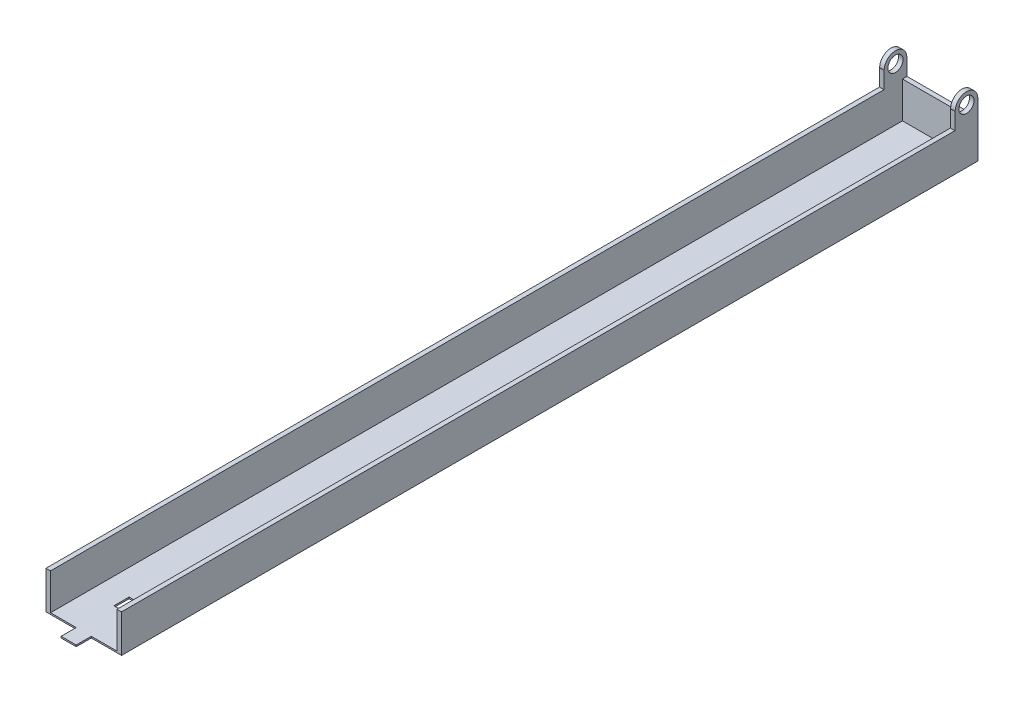
ISO-10303-21;
HEADER;
FILE_DESCRIPTION(('STEP AP214'),'2;1');
FILE_NAME('part.step','',(''),(''),'','','');
FILE_SCHEMA(('AUTOMOTIVE_DESIGN { 1 0 10303 214 1 1 1 1 }'));
ENDSEC;
DATA;
#1=APPLICATION_CONTEXT('core data for automotive mechanical design processes');
#2=APPLICATION_PROTOCOL_DEFINITION('international standard','automotive_design',2000,#1);
#3=PRODUCT_CONTEXT('',#1,'mechanical');
#4=PRODUCT('Part','Part','',(#3));
#5=PRODUCT_RELATED_PRODUCT_CATEGORY('part','',(#4));
#6=PRODUCT_DEFINITION_FORMATION('','',#4);
#7=PRODUCT_DEFINITION_CONTEXT('part definition',#1,'design');
#8=PRODUCT_DEFINITION('design','',#6,#7);
#9=PRODUCT_DEFINITION_SHAPE('','',#8);
#10=(LENGTH_UNIT() NAMED_UNIT(*) SI_UNIT(.MILLI.,.METRE.));
#11=(NAMED_UNIT(*) PLANE_ANGLE_UNIT() SI_UNIT($,.RADIAN.));
#12=(NAMED_UNIT(*) SI_UNIT($,.STERADIAN.) SOLID_ANGLE_UNIT());
#13=UNCERTAINTY_MEASURE_WITH_UNIT(LENGTH_MEASURE(1.E-05),#10,'distance_accuracy_value','');
#14=(GEOMETRIC_REPRESENTATION_CONTEXT(3) GLOBAL_UNCERTAINTY_ASSIGNED_CONTEXT((#13)) GLOBAL_UNIT_ASSIGNED_CONTEXT((#10,
#11,#12)) REPRESENTATION_CONTEXT('',''));
#15=CARTESIAN_POINT('',(0.,0.,0.));
#16=DIRECTION('',(0.,0.,1.));
#17=DIRECTION('',(1.,0.,0.));
#18=AXIS2_PLACEMENT_3D('',#15,#16,#17);
#19=CARTESIAN_POINT('',(0.,0.,-0.762));
#20=DIRECTION('',(0.,0.,-1.));
#21=DIRECTION('',(-1.,0.,0.));
#22=AXIS2_PLACEMENT_3D('',#19,#20,#21);
#23=PLANE('',#22);
#24=DIRECTION('',(0.,1.,0.));
#25=VECTOR('',#24,1.);
#26=CARTESIAN_POINT('',(1.27,-2.921,-0.762));
#27=LINE('',#26,#25);
#28=CARTESIAN_POINT('',(1.27,-3.175,-0.762));
#29=VERTEX_POINT('',#28);
#30=CARTESIAN_POINT('',(1.27,-2.921,-0.762));
#31=VERTEX_POINT('',#30);
#32=EDGE_CURVE('E248',#29,#31,#27,.T.);
#33=ORIENTED_EDGE('',*,*,#32,.F.);
#34=DIRECTION('',(1.,0.,0.));
#35=VECTOR('',#34,1.);
#36=CARTESIAN_POINT('',(-6.35,-3.175,-0.762));
#37=LINE('',#36,#35);
#38=CARTESIAN_POINT('',(6.35,-3.175,-0.762));
#39=VERTEX_POINT('',#38);
#40=EDGE_CURVE('E282',#29,#39,#37,.T.);
#41=ORIENTED_EDGE('',*,*,#40,.T.);
#42=DIRECTION('',(0.,1.,0.));
#43=VECTOR('',#42,1.);
#44=CARTESIAN_POINT('',(6.35,-3.175,-0.762));
#45=LINE('',#44,#43);
#46=CARTESIAN_POINT('',(6.35,3.175,-0.762));
#47=VERTEX_POINT('',#46);
#48=EDGE_CURVE('E275',#39,#47,#45,.T.);
#49=ORIENTED_EDGE('',*,*,#48,.T.);
#50=DIRECTION('',(-1.,0.,0.));
#51=VECTOR('',#50,1.);
#52=CARTESIAN_POINT('',(-6.35,3.175,-0.762));
#53=LINE('',#52,#51);
#54=CARTESIAN_POINT('',(5.588,3.175,-0.762));
#55=VERTEX_POINT('',#54);
#56=EDGE_CURVE('E278',#47,#55,#53,.T.);
#57=ORIENTED_EDGE('',*,*,#56,.T.);
#58=DIRECTION('',(0.,1.,0.));
#59=VECTOR('',#58,1.);
#60=CARTESIAN_POINT('',(5.588,-2.921,-0.762));
#61=LINE('',#60,#59);
#62=CARTESIAN_POINT('',(5.588,-2.921,-0.762));
#63=VERTEX_POINT('',#62);
#64=EDGE_CURVE('E285',#63,#55,#61,.T.);
#65=ORIENTED_EDGE('',*,*,#64,.F.);
#66=DIRECTION('',(-1.,0.,0.));
#67=VECTOR('',#66,1.);
#68=CARTESIAN_POINT('',(0.,-2.921,-0.762));
#69=LINE('',#68,#67);
#70=EDGE_CURVE('E11',#63,#31,#69,.T.);
#71=ORIENTED_EDGE('',*,*,#70,.T.);
#72=EDGE_LOOP('',(#33,#41,#49,#57,#65,#71));
#73=FACE_BOUND('',#72,.T.);
#74=ADVANCED_FACE('F41',(#73),#23,.F.);
#75=DIRECTION('',(0.,-1.,0.));
#76=VECTOR('',#75,1.);
#77=CARTESIAN_POINT('',(-1.27,-2.921,-0.762));
#78=LINE('',#77,#76);
#79=CARTESIAN_POINT('',(-1.27,-2.921,-0.762));
#80=VERTEX_POINT('',#79);
#81=CARTESIAN_POINT('',(-1.27,-3.175,-0.762));
#82=VERTEX_POINT('',#81);
#83=EDGE_CURVE('E253',#80,#82,#78,.T.);
#84=ORIENTED_EDGE('',*,*,#83,.F.);
#85=CARTESIAN_POINT('',(-5.588,-2.921,-0.762));
#86=VERTEX_POINT('',#85);
#87=EDGE_CURVE('E49',#80,#86,#69,.T.);
#88=ORIENTED_EDGE('',*,*,#87,.T.);
#89=DIRECTION('',(0.,-1.,0.));
#90=VECTOR('',#89,1.);
#91=CARTESIAN_POINT('',(-5.588,-2.921,-0.762000000000013));
#92=LINE('',#91,#90);
#93=CARTESIAN_POINT('',(-5.588,3.175,-0.762));
#94=VERTEX_POINT('',#93);
#95=EDGE_CURVE('E288',#94,#86,#92,.T.);
#96=ORIENTED_EDGE('',*,*,#95,.F.);
#97=CARTESIAN_POINT('',(-6.35,3.175,-0.762));
#98=VERTEX_POINT('',#97);
#99=EDGE_CURVE('E277',#94,#98,#53,.T.);
#100=ORIENTED_EDGE('',*,*,#99,.T.);
#101=DIRECTION('',(0.,-1.,0.));
#102=VECTOR('',#101,1.);
#103=CARTESIAN_POINT('',(-6.35,-3.175,-0.762));
#104=LINE('',#103,#102);
#105=CARTESIAN_POINT('',(-6.35,-3.175,-0.762));
#106=VERTEX_POINT('',#105);
#107=EDGE_CURVE('E280',#98,#106,#104,.T.);
#108=ORIENTED_EDGE('',*,*,#107,.T.);
#109=EDGE_CURVE('E283',#106,#82,#37,.T.);
#110=ORIENTED_EDGE('',*,*,#109,.T.);
#111=EDGE_LOOP('',(#84,#88,#96,#100,#108,#110));
#112=FACE_BOUND('',#111,.T.);
#113=ADVANCED_FACE('F461',(#112),#23,.F.);
#114=CARTESIAN_POINT('',(-6.35,3.175,-144.78));
#115=DIRECTION('',(0.,1.,0.));
#116=DIRECTION('',(0.,0.,1.));
#117=AXIS2_PLACEMENT_3D('',#114,#115,#116);
#118=PLANE('',#117);
#119=ORIENTED_EDGE('',*,*,#56,.F.);
#120=DIRECTION('',(0.,0.,1.));
#121=VECTOR('',#120,1.);
#122=CARTESIAN_POINT('',(6.35,3.175,-144.78));
#123=LINE('',#122,#121);
#124=CARTESIAN_POINT('',(6.35,3.175,-140.908247461621));
#125=VERTEX_POINT('',#124);
#126=EDGE_CURVE('E414',#125,#47,#123,.T.);
#127=ORIENTED_EDGE('',*,*,#126,.F.);
#128=DIRECTION('',(1.,0.,0.));
#129=VECTOR('',#128,1.);
#130=CARTESIAN_POINT('',(5.588,3.175,-140.908247461621));
#131=LINE('',#130,#129);
#132=CARTESIAN_POINT('',(5.588,3.175,-140.908247461621));
#133=VERTEX_POINT('',#132);
#134=EDGE_CURVE('E371',#133,#125,#131,.T.);
#135=ORIENTED_EDGE('',*,*,#134,.F.);
#136=DIRECTION('',(0.,0.,-1.));
#137=VECTOR('',#136,1.);
#138=CARTESIAN_POINT('',(5.588,3.175,-0.762));
#139=LINE('',#138,#137);
#140=EDGE_CURVE('E373',#55,#133,#139,.T.);
#141=ORIENTED_EDGE('',*,*,#140,.F.);
#142=EDGE_LOOP('',(#119,#127,#135,#141));
#143=FACE_BOUND('',#142,.T.);
#144=ADVANCED_FACE('F431',(#143),#118,.T.);
#145=DIRECTION('',(-1.,0.,0.));
#146=VECTOR('',#145,1.);
#147=CARTESIAN_POINT('',(-6.35,3.175,-144.78));
#148=LINE('',#147,#146);
#149=CARTESIAN_POINT('',(5.588,3.175,-144.78));
#150=VERTEX_POINT('',#149);
#151=CARTESIAN_POINT('',(-5.588,3.175,-144.78));
#152=VERTEX_POINT('',#151);
#153=EDGE_CURVE('E405',#150,#152,#148,.T.);
#154=ORIENTED_EDGE('',*,*,#153,.T.);
#155=DIRECTION('',(0.,0.,-1.));
#156=VECTOR('',#155,1.);
#157=CARTESIAN_POINT('',(-5.588,3.175,-140.908247461621));
#158=LINE('',#157,#156);
#159=CARTESIAN_POINT('',(-5.588,3.175,-144.018));
#160=VERTEX_POINT('',#159);
#161=EDGE_CURVE('E298',#160,#152,#158,.T.);
#162=ORIENTED_EDGE('',*,*,#161,.F.);
#163=DIRECTION('',(-1.,0.,0.));
#164=VECTOR('',#163,1.);
#165=CARTESIAN_POINT('',(5.588,3.175,-144.018));
#166=LINE('',#165,#164);
#167=CARTESIAN_POINT('',(5.588,3.175,-144.018));
#168=VERTEX_POINT('',#167);
#169=EDGE_CURVE('E393',#168,#160,#166,.T.);
#170=ORIENTED_EDGE('',*,*,#169,.F.);
#171=DIRECTION('',(0.,0.,-1.));
#172=VECTOR('',#171,1.);
#173=CARTESIAN_POINT('',(5.588,3.175,-140.908247461621));
#174=LINE('',#173,#172);
#175=EDGE_CURVE('E340',#168,#150,#174,.T.);
#176=ORIENTED_EDGE('',*,*,#175,.T.);
#177=EDGE_LOOP('',(#154,#162,#170,#176));
#178=FACE_BOUND('',#177,.T.);
#179=ADVANCED_FACE('F470',(#178),#118,.T.);
#180=ORIENTED_EDGE('',*,*,#99,.F.);
#181=DIRECTION('',(0.,0.,1.));
#182=VECTOR('',#181,1.);
#183=CARTESIAN_POINT('',(-5.588,3.175,-144.018));
#184=LINE('',#183,#182);
#185=CARTESIAN_POINT('',(-5.588,3.175,-140.908247461621));
#186=VERTEX_POINT('',#185);
#187=EDGE_CURVE('E386',#186,#94,#184,.T.);
#188=ORIENTED_EDGE('',*,*,#187,.F.);
#189=DIRECTION('',(-1.,0.,0.));
#190=VECTOR('',#189,1.);
#191=CARTESIAN_POINT('',(-5.588,3.175,-140.908247461621));
#192=LINE('',#191,#190);
#193=CARTESIAN_POINT('',(-6.35,3.175,-140.908247461621));
#194=VERTEX_POINT('',#193);
#195=EDGE_CURVE('E312',#186,#194,#192,.T.);
#196=ORIENTED_EDGE('',*,*,#195,.T.);
#197=DIRECTION('',(0.,0.,1.));
#198=VECTOR('',#197,1.);
#199=CARTESIAN_POINT('',(-6.35,3.175,-144.78));
#200=LINE('',#199,#198);
#201=EDGE_CURVE('E420',#194,#98,#200,.T.);
#202=ORIENTED_EDGE('',*,*,#201,.T.);
#203=EDGE_LOOP('',(#180,#188,#196,#202));
#204=FACE_BOUND('',#203,.T.);
#205=ADVANCED_FACE('F500',(#204),#118,.T.);
#206=CARTESIAN_POINT('',(6.35,3.175,-144.78));
#207=DIRECTION('',(1.,0.,0.));
#208=DIRECTION('',(0.,0.,-1.));
#209=AXIS2_PLACEMENT_3D('',#206,#207,#208);
#210=PLANE('',#209);
#211=ORIENTED_EDGE('',*,*,#48,.F.);
#212=DIRECTION('',(0.,0.,1.));
#213=VECTOR('',#212,1.);
#214=CARTESIAN_POINT('',(6.35,-3.175,-144.78));
#215=LINE('',#214,#213);
#216=CARTESIAN_POINT('',(6.35,-3.175,-144.78));
#217=VERTEX_POINT('',#216);
#218=EDGE_CURVE('E343',#217,#39,#215,.T.);
#219=ORIENTED_EDGE('',*,*,#218,.F.);
#220=DIRECTION('',(0.,1.,0.));
#221=VECTOR('',#220,1.);
#222=CARTESIAN_POINT('',(6.35,3.175,-144.78));
#223=LINE('',#222,#221);
#224=CARTESIAN_POINT('',(6.35,5.97952896515607,-144.78));
#225=VERTEX_POINT('',#224);
#226=EDGE_CURVE('E401',#217,#225,#223,.T.);
#227=ORIENTED_EDGE('',*,*,#226,.T.);
#228=DIRECTION('',(0.,0.,1.));
#229=VECTOR('',#228,1.);
#230=CARTESIAN_POINT('',(6.35,5.97952896515607,-144.78));
#231=LINE('',#230,#229);
#232=CARTESIAN_POINT('',(6.35,5.97952896515607,-144.749123730811));
#233=VERTEX_POINT('',#232);
#234=EDGE_CURVE('E337',#225,#233,#231,.T.);
#235=ORIENTED_EDGE('',*,*,#234,.T.);
#236=CARTESIAN_POINT('',(6.35,5.97952896515607,-142.844123730811));
#237=DIRECTION('',(1.,0.,0.));
#238=DIRECTION('',(0.,0.,-1.));
#239=AXIS2_PLACEMENT_3D('',#236,#237,#238);
#240=CIRCLE('',#239,1.90499999999999);
#241=CARTESIAN_POINT('',(6.35,5.97952896515607,-140.939123730811));
#242=VERTEX_POINT('',#241);
#243=EDGE_CURVE('E363',#233,#242,#240,.T.);
#244=ORIENTED_EDGE('',*,*,#243,.T.);
#245=DIRECTION('',(0.,0.,1.));
#246=VECTOR('',#245,1.);
#247=CARTESIAN_POINT('',(6.35,5.97952896515607,-140.939123730811));
#248=LINE('',#247,#246);
#249=CARTESIAN_POINT('',(6.35,5.97952896515607,-140.908247461621));
#250=VERTEX_POINT('',#249);
#251=EDGE_CURVE('E366',#242,#250,#248,.T.);
#252=ORIENTED_EDGE('',*,*,#251,.T.);
#253=DIRECTION('',(0.,-1.,0.));
#254=VECTOR('',#253,1.);
#255=CARTESIAN_POINT('',(6.35,5.97952896515607,-140.908247461621));
#256=LINE('',#255,#254);
#257=EDGE_CURVE('E348',#250,#125,#256,.T.);
#258=ORIENTED_EDGE('',*,*,#257,.T.);
#259=ORIENTED_EDGE('',*,*,#126,.T.);
#260=EDGE_LOOP('',(#211,#219,#227,#235,#244,#252,#258,#259));
#261=FACE_BOUND('',#260,.T.);
#262=CARTESIAN_POINT('',(6.35,5.97952896515607,-142.844123730811));
#263=DIRECTION('',(1.,0.,0.));
#264=DIRECTION('',(0.,0.,-1.));
#265=AXIS2_PLACEMENT_3D('',#262,#263,#264);
#266=CIRCLE('',#265,1.27);
#267=CARTESIAN_POINT('',(6.35,5.97952896515607,-144.114123730811));
#268=VERTEX_POINT('',#267);
#269=EDGE_CURVE('E322',#268,#268,#266,.T.);
#270=ORIENTED_EDGE('',*,*,#269,.F.);
#271=EDGE_LOOP('',(#270));
#272=FACE_BOUND('',#271,.T.);
#273=ADVANCED_FACE('F43',(#261,#272),#210,.T.);
#274=CARTESIAN_POINT('',(-6.35,-3.175,-144.78));
#275=DIRECTION('',(0.,-1.,0.));
#276=DIRECTION('',(0.,0.,-1.));
#277=AXIS2_PLACEMENT_3D('',#274,#275,#276);
#278=PLANE('',#277);
#279=DIRECTION('',(0.,0.,1.));
#280=VECTOR('',#279,1.);
#281=CARTESIAN_POINT('',(1.26999999999999,-3.175,-144.78));
#282=LINE('',#281,#280);
#283=CARTESIAN_POINT('',(1.27,-3.175,-9.652));
#284=VERTEX_POINT('',#283);
#285=CARTESIAN_POINT('',(1.27,-3.175,-7.112));
#286=VERTEX_POINT('',#285);
#287=EDGE_CURVE('E246',#284,#286,#282,.T.);
#288=ORIENTED_EDGE('',*,*,#287,.F.);
#289=DIRECTION('',(1.,0.,0.));
#290=VECTOR('',#289,1.);
#291=CARTESIAN_POINT('',(-6.35,-3.175,-9.65199999999999));
#292=LINE('',#291,#290);
#293=CARTESIAN_POINT('',(-1.27,-3.175,-9.65199999999999));
#294=VERTEX_POINT('',#293);
#295=EDGE_CURVE('E239',#294,#284,#292,.T.);
#296=ORIENTED_EDGE('',*,*,#295,.F.);
#297=DIRECTION('',(0.,0.,-1.));
#298=VECTOR('',#297,1.);
#299=CARTESIAN_POINT('',(-1.27000000000002,-3.175,-144.78));
#300=LINE('',#299,#298);
#301=CARTESIAN_POINT('',(-1.27,-3.175,-7.112));
#302=VERTEX_POINT('',#301);
#303=EDGE_CURVE('E219',#302,#294,#300,.T.);
#304=ORIENTED_EDGE('',*,*,#303,.F.);
#305=DIRECTION('',(-1.,0.,0.));
#306=VECTOR('',#305,1.);
#307=CARTESIAN_POINT('',(-6.35,-3.175,-7.11200000000001));
#308=LINE('',#307,#306);
#309=EDGE_CURVE('E244',#286,#302,#308,.T.);
#310=ORIENTED_EDGE('',*,*,#309,.F.);
#311=EDGE_LOOP('',(#288,#296,#304,#310));
#312=FACE_BOUND('',#311,.T.);
#313=ORIENTED_EDGE('',*,*,#109,.F.);
#314=DIRECTION('',(0.,0.,1.));
#315=VECTOR('',#314,1.);
#316=CARTESIAN_POINT('',(-6.35,-3.175,-144.78));
#317=LINE('',#316,#315);
#318=CARTESIAN_POINT('',(-6.35,-3.175,-144.78));
#319=VERTEX_POINT('',#318);
#320=EDGE_CURVE('E417',#319,#106,#317,.T.);
#321=ORIENTED_EDGE('',*,*,#320,.F.);
#322=DIRECTION('',(1.,0.,0.));
#323=VECTOR('',#322,1.);
#324=CARTESIAN_POINT('',(-6.35,-3.175,-144.78));
#325=LINE('',#324,#323);
#326=EDGE_CURVE('E411',#319,#217,#325,.T.);
#327=ORIENTED_EDGE('',*,*,#326,.T.);
#328=ORIENTED_EDGE('',*,*,#218,.T.);
#329=ORIENTED_EDGE('',*,*,#40,.F.);
#330=DIRECTION('',(0.,0.,-1.));
#331=VECTOR('',#330,1.);
#332=CARTESIAN_POINT('',(1.27,-3.175,1.778));
#333=LINE('',#332,#331);
#334=CARTESIAN_POINT('',(1.27,-3.175,1.778));
#335=VERTEX_POINT('',#334);
#336=EDGE_CURVE('E259',#335,#29,#333,.T.);
#337=ORIENTED_EDGE('',*,*,#336,.F.);
#338=DIRECTION('',(1.,0.,0.));
#339=VECTOR('',#338,1.);
#340=CARTESIAN_POINT('',(-1.27,-3.175,1.778));
#341=LINE('',#340,#339);
#342=CARTESIAN_POINT('',(-1.27,-3.175,1.778));
#343=VERTEX_POINT('',#342);
#344=EDGE_CURVE('E257',#343,#335,#341,.T.);
#345=ORIENTED_EDGE('',*,*,#344,.F.);
#346=DIRECTION('',(0.,0.,-1.));
#347=VECTOR('',#346,1.);
#348=CARTESIAN_POINT('',(-1.27,-3.175,1.778));
#349=LINE('',#348,#347);
#350=EDGE_CURVE('E266',#343,#82,#349,.T.);
#351=ORIENTED_EDGE('',*,*,#350,.T.);
#352=EDGE_LOOP('',(#313,#321,#327,#328,#329,#337,#345,#351));
#353=FACE_BOUND('',#352,.T.);
#354=ADVANCED_FACE('F448',(#312,#353),#278,.T.);
#355=CARTESIAN_POINT('',(-6.35,3.175,-144.78));
#356=DIRECTION('',(-1.,0.,0.));
#357=DIRECTION('',(0.,0.,1.));
#358=AXIS2_PLACEMENT_3D('',#355,#356,#357);
#359=PLANE('',#358);
#360=ORIENTED_EDGE('',*,*,#107,.F.);
#361=ORIENTED_EDGE('',*,*,#201,.F.);
#362=DIRECTION('',(0.,-1.,0.));
#363=VECTOR('',#362,1.);
#364=CARTESIAN_POINT('',(-6.35,5.97952896515607,-140.908247461621));
#365=LINE('',#364,#363);
#366=CARTESIAN_POINT('',(-6.35,5.97952896515607,-140.908247461621));
#367=VERTEX_POINT('',#366);
#368=EDGE_CURVE('E295',#367,#194,#365,.T.);
#369=ORIENTED_EDGE('',*,*,#368,.F.);
#370=DIRECTION('',(0.,0.,1.));
#371=VECTOR('',#370,1.);
#372=CARTESIAN_POINT('',(-6.35,5.97952896515607,-140.939123730811));
#373=LINE('',#372,#371);
#374=CARTESIAN_POINT('',(-6.35,5.97952896515607,-140.939123730811));
#375=VERTEX_POINT('',#374);
#376=EDGE_CURVE('E314',#375,#367,#373,.T.);
#377=ORIENTED_EDGE('',*,*,#376,.F.);
#378=CARTESIAN_POINT('',(-6.35,5.97952896515607,-142.844123730811));
#379=DIRECTION('',(1.,0.,0.));
#380=DIRECTION('',(0.,0.,-1.));
#381=AXIS2_PLACEMENT_3D('',#378,#379,#380);
#382=CIRCLE('',#381,1.90499999999999);
#383=CARTESIAN_POINT('',(-6.35,5.97952896515607,-144.749123730811));
#384=VERTEX_POINT('',#383);
#385=EDGE_CURVE('E316',#384,#375,#382,.T.);
#386=ORIENTED_EDGE('',*,*,#385,.F.);
#387=DIRECTION('',(0.,0.,1.));
#388=VECTOR('',#387,1.);
#389=CARTESIAN_POINT('',(-6.35,5.97952896515607,-144.78));
#390=LINE('',#389,#388);
#391=CARTESIAN_POINT('',(-6.35,5.97952896515607,-144.78));
#392=VERTEX_POINT('',#391);
#393=EDGE_CURVE('E301',#392,#384,#390,.T.);
#394=ORIENTED_EDGE('',*,*,#393,.F.);
#395=DIRECTION('',(0.,-1.,0.));
#396=VECTOR('',#395,1.);
#397=CARTESIAN_POINT('',(-6.35,3.175,-144.78));
#398=LINE('',#397,#396);
#399=EDGE_CURVE('E408',#392,#319,#398,.T.);
#400=ORIENTED_EDGE('',*,*,#399,.T.);
#401=ORIENTED_EDGE('',*,*,#320,.T.);
#402=EDGE_LOOP('',(#360,#361,#369,#377,#386,#394,#400,#401));
#403=FACE_BOUND('',#402,.T.);
#404=CARTESIAN_POINT('',(-6.35,5.97952896515607,-142.844123730811));
#405=DIRECTION('',(1.,0.,0.));
#406=DIRECTION('',(0.,0.,-1.));
#407=AXIS2_PLACEMENT_3D('',#404,#405,#406);
#408=CIRCLE('',#407,1.27);
#409=CARTESIAN_POINT('',(-6.35,5.97952896515607,-141.574123730811));
#410=VERTEX_POINT('',#409);
#411=EDGE_CURVE('E291',#410,#410,#408,.T.);
#412=ORIENTED_EDGE('',*,*,#411,.T.);
#413=EDGE_LOOP('',(#412));
#414=FACE_BOUND('',#413,.T.);
#415=ADVANCED_FACE('F504',(#403,#414),#359,.T.);
#416=CARTESIAN_POINT('',(0.,0.,-144.78));
#417=DIRECTION('',(0.,0.,1.));
#418=DIRECTION('',(1.,0.,0.));
#419=AXIS2_PLACEMENT_3D('',#416,#417,#418);
#420=PLANE('',#419);
#421=ORIENTED_EDGE('',*,*,#226,.F.);
#422=ORIENTED_EDGE('',*,*,#326,.F.);
#423=ORIENTED_EDGE('',*,*,#399,.F.);
#424=DIRECTION('',(-1.,0.,0.));
#425=VECTOR('',#424,1.);
#426=CARTESIAN_POINT('',(-5.588,5.97952896515607,-144.78));
#427=LINE('',#426,#425);
#428=CARTESIAN_POINT('',(-5.588,5.97952896515607,-144.78));
#429=VERTEX_POINT('',#428);
#430=EDGE_CURVE('E319',#429,#392,#427,.T.);
#431=ORIENTED_EDGE('',*,*,#430,.F.);
#432=DIRECTION('',(0.,1.,0.));
#433=VECTOR('',#432,1.);
#434=CARTESIAN_POINT('',(-5.588,3.175,-144.78));
#435=LINE('',#434,#433);
#436=EDGE_CURVE('E310',#152,#429,#435,.T.);
#437=ORIENTED_EDGE('',*,*,#436,.F.);
#438=ORIENTED_EDGE('',*,*,#153,.F.);
#439=DIRECTION('',(0.,1.,0.));
#440=VECTOR('',#439,1.);
#441=CARTESIAN_POINT('',(5.588,3.175,-144.78));
#442=LINE('',#441,#440);
#443=CARTESIAN_POINT('',(5.588,5.97952896515607,-144.78));
#444=VERTEX_POINT('',#443);
#445=EDGE_CURVE('E344',#150,#444,#442,.T.);
#446=ORIENTED_EDGE('',*,*,#445,.T.);
#447=DIRECTION('',(1.,0.,0.));
#448=VECTOR('',#447,1.);
#449=CARTESIAN_POINT('',(5.588,5.97952896515607,-144.78));
#450=LINE('',#449,#448);
#451=EDGE_CURVE('E360',#444,#225,#450,.T.);
#452=ORIENTED_EDGE('',*,*,#451,.T.);
#453=EDGE_LOOP('',(#421,#422,#423,#431,#437,#438,#446,#452));
#454=FACE_BOUND('',#453,.T.);
#455=ADVANCED_FACE('F476',(#454),#420,.F.);
#456=CARTESIAN_POINT('',(-5.588,-2.921,-144.018));
#457=DIRECTION('',(-1.,0.,0.));
#458=DIRECTION('',(0.,0.,1.));
#459=AXIS2_PLACEMENT_3D('',#456,#457,#458);
#460=PLANE('',#459);
#461=ORIENTED_EDGE('',*,*,#187,.T.);
#462=ORIENTED_EDGE('',*,*,#95,.T.);
#463=DIRECTION('',(0.,0.,1.));
#464=VECTOR('',#463,1.);
#465=CARTESIAN_POINT('',(-5.588,-2.921,-0.381));
#466=LINE('',#465,#464);
#467=CARTESIAN_POINT('',(-5.588,-2.921,-144.018));
#468=VERTEX_POINT('',#467);
#469=EDGE_CURVE('E382',#468,#86,#466,.T.);
#470=ORIENTED_EDGE('',*,*,#469,.F.);
#471=DIRECTION('',(0.,1.,0.));
#472=VECTOR('',#471,1.);
#473=CARTESIAN_POINT('',(-5.588,-2.921,-144.018));
#474=LINE('',#473,#472);
#475=EDGE_CURVE('E398',#468,#160,#474,.T.);
#476=ORIENTED_EDGE('',*,*,#475,.T.);
#477=ORIENTED_EDGE('',*,*,#161,.T.);
#478=ORIENTED_EDGE('',*,*,#436,.T.);
#479=DIRECTION('',(0.,0.,1.));
#480=VECTOR('',#479,1.);
#481=CARTESIAN_POINT('',(-5.588,5.97952896515607,-144.78));
#482=LINE('',#481,#480);
#483=CARTESIAN_POINT('',(-5.588,5.97952896515607,-144.749123730811));
#484=VERTEX_POINT('',#483);
#485=EDGE_CURVE('E308',#429,#484,#482,.T.);
#486=ORIENTED_EDGE('',*,*,#485,.T.);
#487=CARTESIAN_POINT('',(-5.588,5.97952896515607,-142.844123730811));
#488=DIRECTION('',(1.,0.,0.));
#489=DIRECTION('',(0.,0.,-1.));
#490=AXIS2_PLACEMENT_3D('',#487,#488,#489);
#491=CIRCLE('',#490,1.90499999999999);
#492=CARTESIAN_POINT('',(-5.588,5.97952896515607,-140.939123730811));
#493=VERTEX_POINT('',#492);
#494=EDGE_CURVE('E306',#484,#493,#491,.T.);
#495=ORIENTED_EDGE('',*,*,#494,.T.);
#496=DIRECTION('',(0.,0.,1.));
#497=VECTOR('',#496,1.);
#498=CARTESIAN_POINT('',(-5.588,5.97952896515607,-140.939123730811));
#499=LINE('',#498,#497);
#500=CARTESIAN_POINT('',(-5.588,5.97952896515607,-140.908247461621));
#501=VERTEX_POINT('',#500);
#502=EDGE_CURVE('E304',#493,#501,#499,.T.);
#503=ORIENTED_EDGE('',*,*,#502,.T.);
#504=DIRECTION('',(0.,-1.,0.));
#505=VECTOR('',#504,1.);
#506=CARTESIAN_POINT('',(-5.588,5.97952896515607,-140.908247461621));
#507=LINE('',#506,#505);
#508=EDGE_CURVE('E300',#501,#186,#507,.T.);
#509=ORIENTED_EDGE('',*,*,#508,.T.);
#510=EDGE_LOOP('',(#461,#462,#470,#476,#477,#478,#486,#495,#503,#509));
#511=FACE_BOUND('',#510,.T.);
#512=CARTESIAN_POINT('',(-5.588,5.97952896515607,-142.844123730811));
#513=DIRECTION('',(1.,0.,0.));
#514=DIRECTION('',(0.,0.,-1.));
#515=AXIS2_PLACEMENT_3D('',#512,#513,#514);
#516=CIRCLE('',#515,1.27);
#517=CARTESIAN_POINT('',(-5.588,5.97952896515607,-141.574123730811));
#518=VERTEX_POINT('',#517);
#519=EDGE_CURVE('E292',#518,#518,#516,.T.);
#520=ORIENTED_EDGE('',*,*,#519,.F.);
#521=EDGE_LOOP('',(#520));
#522=FACE_BOUND('',#521,.T.);
#523=ADVANCED_FACE('F464',(#511,#522),#460,.F.);
#524=CARTESIAN_POINT('',(5.588,-2.921,-144.018));
#525=DIRECTION('',(0.,0.,-1.));
#526=DIRECTION('',(-1.,0.,0.));
#527=AXIS2_PLACEMENT_3D('',#524,#525,#526);
#528=PLANE('',#527);
#529=ORIENTED_EDGE('',*,*,#169,.T.);
#530=ORIENTED_EDGE('',*,*,#475,.F.);
#531=DIRECTION('',(-1.,0.,0.));
#532=VECTOR('',#531,1.);
#533=CARTESIAN_POINT('',(5.588,-2.921,-144.018));
#534=LINE('',#533,#532);
#535=CARTESIAN_POINT('',(5.588,-2.921,-144.018));
#536=VERTEX_POINT('',#535);
#537=EDGE_CURVE('E388',#536,#468,#534,.T.);
#538=ORIENTED_EDGE('',*,*,#537,.F.);
#539=DIRECTION('',(0.,1.,0.));
#540=VECTOR('',#539,1.);
#541=CARTESIAN_POINT('',(5.588,-2.921,-144.018));
#542=LINE('',#541,#540);
#543=EDGE_CURVE('E391',#536,#168,#542,.T.);
#544=ORIENTED_EDGE('',*,*,#543,.T.);
#545=EDGE_LOOP('',(#529,#530,#538,#544));
#546=FACE_BOUND('',#545,.T.);
#547=ADVANCED_FACE('F467',(#546),#528,.F.);
#548=CARTESIAN_POINT('',(5.588,-2.921,-0.762));
#549=DIRECTION('',(1.,0.,0.));
#550=DIRECTION('',(0.,0.,-1.));
#551=AXIS2_PLACEMENT_3D('',#548,#549,#550);
#552=PLANE('',#551);
#553=DIRECTION('',(0.,0.,-1.));
#554=VECTOR('',#553,1.);
#555=CARTESIAN_POINT('',(5.588,-2.921,-0.762));
#556=LINE('',#555,#554);
#557=EDGE_CURVE('E385',#63,#536,#556,.T.);
#558=ORIENTED_EDGE('',*,*,#557,.F.);
#559=ORIENTED_EDGE('',*,*,#64,.T.);
#560=ORIENTED_EDGE('',*,*,#140,.T.);
#561=DIRECTION('',(0.,-1.,0.));
#562=VECTOR('',#561,1.);
#563=CARTESIAN_POINT('',(5.588,5.97952896515607,-140.908247461621));
#564=LINE('',#563,#562);
#565=CARTESIAN_POINT('',(5.588,5.97952896515607,-140.908247461621));
#566=VERTEX_POINT('',#565);
#567=EDGE_CURVE('E357',#566,#133,#564,.T.);
#568=ORIENTED_EDGE('',*,*,#567,.F.);
#569=DIRECTION('',(0.,0.,1.));
#570=VECTOR('',#569,1.);
#571=CARTESIAN_POINT('',(5.588,5.97952896515607,-140.939123730811));
#572=LINE('',#571,#570);
#573=CARTESIAN_POINT('',(5.588,5.97952896515607,-140.939123730811));
#574=VERTEX_POINT('',#573);
#575=EDGE_CURVE('E354',#574,#566,#572,.T.);
#576=ORIENTED_EDGE('',*,*,#575,.F.);
#577=CARTESIAN_POINT('',(5.588,5.97952896515607,-142.844123730811));
#578=DIRECTION('',(1.,0.,0.));
#579=DIRECTION('',(0.,0.,-1.));
#580=AXIS2_PLACEMENT_3D('',#577,#578,#579);
#581=CIRCLE('',#580,1.90499999999999);
#582=CARTESIAN_POINT('',(5.588,5.97952896515607,-144.749123730811));
#583=VERTEX_POINT('',#582);
#584=EDGE_CURVE('E351',#583,#574,#581,.T.);
#585=ORIENTED_EDGE('',*,*,#584,.F.);
#586=DIRECTION('',(0.,0.,1.));
#587=VECTOR('',#586,1.);
#588=CARTESIAN_POINT('',(5.588,5.97952896515607,-144.78));
#589=LINE('',#588,#587);
#590=EDGE_CURVE('E347',#444,#583,#589,.T.);
#591=ORIENTED_EDGE('',*,*,#590,.F.);
#592=ORIENTED_EDGE('',*,*,#445,.F.);
#593=ORIENTED_EDGE('',*,*,#175,.F.);
#594=ORIENTED_EDGE('',*,*,#543,.F.);
#595=EDGE_LOOP('',(#558,#559,#560,#568,#576,#585,#591,#592,#593,#594));
#596=FACE_BOUND('',#595,.T.);
#597=CARTESIAN_POINT('',(5.588,5.97952896515607,-142.844123730811));
#598=DIRECTION('',(1.,0.,0.));
#599=DIRECTION('',(0.,0.,-1.));
#600=AXIS2_PLACEMENT_3D('',#597,#598,#599);
#601=CIRCLE('',#600,1.27);
#602=CARTESIAN_POINT('',(5.588,5.97952896515607,-144.114123730811));
#603=VERTEX_POINT('',#602);
#604=EDGE_CURVE('E334',#603,#603,#601,.T.);
#605=ORIENTED_EDGE('',*,*,#604,.T.);
#606=EDGE_LOOP('',(#605));
#607=FACE_BOUND('',#606,.T.);
#608=ADVANCED_FACE('F437',(#596,#607),#552,.F.);
#609=CARTESIAN_POINT('',(0.,-2.921,0.));
#610=DIRECTION('',(0.,1.,0.));
#611=DIRECTION('',(0.,0.,1.));
#612=AXIS2_PLACEMENT_3D('',#609,#610,#611);
#613=PLANE('',#612);
#614=DIRECTION('',(0.,0.,-1.));
#615=VECTOR('',#614,1.);
#616=CARTESIAN_POINT('',(1.27,-2.921,-9.652));
#617=LINE('',#616,#615);
#618=CARTESIAN_POINT('',(1.27,-2.921,-7.112));
#619=VERTEX_POINT('',#618);
#620=CARTESIAN_POINT('',(1.27,-2.921,-9.652));
#621=VERTEX_POINT('',#620);
#622=EDGE_CURVE('E64',#619,#621,#617,.T.);
#623=ORIENTED_EDGE('',*,*,#622,.F.);
#624=DIRECTION('',(1.,0.,0.));
#625=VECTOR('',#624,1.);
#626=CARTESIAN_POINT('',(-1.27,-2.921,-7.112));
#627=LINE('',#626,#625);
#628=CARTESIAN_POINT('',(-1.27,-2.921,-7.112));
#629=VERTEX_POINT('',#628);
#630=EDGE_CURVE('E232',#629,#619,#627,.T.);
#631=ORIENTED_EDGE('',*,*,#630,.F.);
#632=DIRECTION('',(0.,0.,1.));
#633=VECTOR('',#632,1.);
#634=CARTESIAN_POINT('',(-1.27,-2.921,-9.652));
#635=LINE('',#634,#633);
#636=CARTESIAN_POINT('',(-1.27,-2.921,-9.652));
#637=VERTEX_POINT('',#636);
#638=EDGE_CURVE('E216',#637,#629,#635,.T.);
#639=ORIENTED_EDGE('',*,*,#638,.F.);
#640=DIRECTION('',(-1.,0.,0.));
#641=VECTOR('',#640,1.);
#642=CARTESIAN_POINT('',(-1.27,-2.921,-9.652));
#643=LINE('',#642,#641);
#644=EDGE_CURVE('E225',#621,#637,#643,.T.);
#645=ORIENTED_EDGE('',*,*,#644,.F.);
#646=EDGE_LOOP('',(#623,#631,#639,#645));
#647=FACE_BOUND('',#646,.T.);
#648=ORIENTED_EDGE('',*,*,#70,.F.);
#649=ORIENTED_EDGE('',*,*,#557,.T.);
#650=ORIENTED_EDGE('',*,*,#537,.T.);
#651=ORIENTED_EDGE('',*,*,#469,.T.);
#652=ORIENTED_EDGE('',*,*,#87,.F.);
#653=DIRECTION('',(0.,0.,-1.));
#654=VECTOR('',#653,1.);
#655=CARTESIAN_POINT('',(-1.27,-2.921,1.778));
#656=LINE('',#655,#654);
#657=CARTESIAN_POINT('',(-1.27,-2.921,1.778));
#658=VERTEX_POINT('',#657);
#659=EDGE_CURVE('E269',#658,#80,#656,.T.);
#660=ORIENTED_EDGE('',*,*,#659,.F.);
#661=DIRECTION('',(-1.,0.,0.));
#662=VECTOR('',#661,1.);
#663=CARTESIAN_POINT('',(-1.27,-2.921,1.778));
#664=LINE('',#663,#662);
#665=CARTESIAN_POINT('',(1.27,-2.921,1.778));
#666=VERTEX_POINT('',#665);
#667=EDGE_CURVE('E252',#666,#658,#664,.T.);
#668=ORIENTED_EDGE('',*,*,#667,.F.);
#669=DIRECTION('',(0.,0.,-1.));
#670=VECTOR('',#669,1.);
#671=CARTESIAN_POINT('',(1.27,-2.921,1.778));
#672=LINE('',#671,#670);
#673=EDGE_CURVE('E272',#666,#31,#672,.T.);
#674=ORIENTED_EDGE('',*,*,#673,.T.);
#675=EDGE_LOOP('',(#648,#649,#650,#651,#652,#660,#668,#674));
#676=FACE_BOUND('',#675,.T.);
#677=ADVANCED_FACE('F229',(#647,#676),#613,.T.);
#678=CARTESIAN_POINT('',(5.588,5.97952896515607,-140.908247461621));
#679=DIRECTION('',(0.,0.,1.));
#680=DIRECTION('',(1.,0.,0.));
#681=AXIS2_PLACEMENT_3D('',#678,#679,#680);
#682=PLANE('',#681);
#683=ORIENTED_EDGE('',*,*,#257,.F.);
#684=DIRECTION('',(1.,0.,0.));
#685=VECTOR('',#684,1.);
#686=CARTESIAN_POINT('',(5.588,5.97952896515607,-140.908247461621));
#687=LINE('',#686,#685);
#688=EDGE_CURVE('E374',#566,#250,#687,.T.);
#689=ORIENTED_EDGE('',*,*,#688,.F.);
#690=ORIENTED_EDGE('',*,*,#567,.T.);
#691=ORIENTED_EDGE('',*,*,#134,.T.);
#692=EDGE_LOOP('',(#683,#689,#690,#691));
#693=FACE_BOUND('',#692,.T.);
#694=ADVANCED_FACE('F519',(#693),#682,.T.);
#695=CARTESIAN_POINT('',(5.588,5.97952896515607,-140.939123730811));
#696=DIRECTION('',(0.,1.,0.));
#697=DIRECTION('',(0.,0.,1.));
#698=AXIS2_PLACEMENT_3D('',#695,#696,#697);
#699=PLANE('',#698);
#700=ORIENTED_EDGE('',*,*,#251,.F.);
#701=DIRECTION('',(1.,0.,0.));
#702=VECTOR('',#701,1.);
#703=CARTESIAN_POINT('',(5.588,5.97952896515607,-140.939123730811));
#704=LINE('',#703,#702);
#705=EDGE_CURVE('E376',#574,#242,#704,.T.);
#706=ORIENTED_EDGE('',*,*,#705,.F.);
#707=ORIENTED_EDGE('',*,*,#575,.T.);
#708=ORIENTED_EDGE('',*,*,#688,.T.);
#709=EDGE_LOOP('',(#700,#706,#707,#708));
#710=FACE_BOUND('',#709,.T.);
#711=ADVANCED_FACE('F517',(#710),#699,.T.);
#712=CARTESIAN_POINT('',(5.588,5.97952896515607,-142.844123730811));
#713=DIRECTION('',(1.,0.,0.));
#714=DIRECTION('',(0.,0.,-1.));
#715=AXIS2_PLACEMENT_3D('',#712,#713,#714);
#716=CYLINDRICAL_SURFACE('',#715,1.90499999999999);
#717=ORIENTED_EDGE('',*,*,#243,.F.);
#718=DIRECTION('',(1.,0.,0.));
#719=VECTOR('',#718,1.);
#720=CARTESIAN_POINT('',(5.588,5.97952896515607,-144.749123730811));
#721=LINE('',#720,#719);
#722=EDGE_CURVE('E378',#583,#233,#721,.T.);
#723=ORIENTED_EDGE('',*,*,#722,.F.);
#724=ORIENTED_EDGE('',*,*,#584,.T.);
#725=ORIENTED_EDGE('',*,*,#705,.T.);
#726=EDGE_LOOP('',(#717,#723,#724,#725));
#727=FACE_BOUND('',#726,.T.);
#728=ADVANCED_FACE('F513',(#727),#716,.T.);
#729=CARTESIAN_POINT('',(5.588,5.97952896515607,-144.78));
#730=DIRECTION('',(0.,1.,0.));
#731=DIRECTION('',(0.,0.,1.));
#732=AXIS2_PLACEMENT_3D('',#729,#730,#731);
#733=PLANE('',#732);
#734=ORIENTED_EDGE('',*,*,#234,.F.);
#735=ORIENTED_EDGE('',*,*,#451,.F.);
#736=ORIENTED_EDGE('',*,*,#590,.T.);
#737=ORIENTED_EDGE('',*,*,#722,.T.);
#738=EDGE_LOOP('',(#734,#735,#736,#737));
#739=FACE_BOUND('',#738,.T.);
#740=ADVANCED_FACE('F509',(#739),#733,.T.);
#741=CARTESIAN_POINT('',(5.588,5.97952896515607,-142.844123730811));
#742=DIRECTION('',(1.,0.,0.));
#743=DIRECTION('',(0.,0.,-1.));
#744=AXIS2_PLACEMENT_3D('',#741,#742,#743);
#745=CYLINDRICAL_SURFACE('',#744,1.27);
#746=CARTESIAN_POINT('',(5.588,5.97952896515607,-144.114123730811));
#747=CARTESIAN_POINT('',(5.5959375,5.97952896515607,-144.114123730811));
#748=CARTESIAN_POINT('',(5.603875,5.97952896515607,-144.114123730811));
#749=CARTESIAN_POINT('',(5.61975,5.97952896515607,-144.114123730811));
#750=CARTESIAN_POINT('',(5.6276875,5.97952896515607,-144.114123730811));
#751=CARTESIAN_POINT('',(5.6435625,5.97952896515607,-144.114123730811));
#752=CARTESIAN_POINT('',(5.6515,5.97952896515607,-144.114123730811));
#753=CARTESIAN_POINT('',(5.667375,5.97952896515607,-144.114123730811));
#754=CARTESIAN_POINT('',(5.6753125,5.97952896515607,-144.114123730811));
#755=CARTESIAN_POINT('',(5.6911875,5.97952896515607,-144.114123730811));
#756=CARTESIAN_POINT('',(5.699125,5.97952896515607,-144.114123730811));
#757=CARTESIAN_POINT('',(5.715,5.97952896515607,-144.114123730811));
#758=CARTESIAN_POINT('',(5.7229375,5.97952896515607,-144.114123730811));
#759=CARTESIAN_POINT('',(5.7388125,5.97952896515607,-144.114123730811));
#760=CARTESIAN_POINT('',(5.74675,5.97952896515607,-144.114123730811));
#761=CARTESIAN_POINT('',(5.762625,5.97952896515607,-144.114123730811));
#762=CARTESIAN_POINT('',(5.7705625,5.97952896515607,-144.114123730811));
#763=CARTESIAN_POINT('',(5.7864375,5.97952896515607,-144.114123730811));
#764=CARTESIAN_POINT('',(5.794375,5.97952896515607,-144.114123730811));
#765=CARTESIAN_POINT('',(5.81025,5.97952896515607,-144.114123730811));
#766=CARTESIAN_POINT('',(5.8181875,5.97952896515607,-144.114123730811));
#767=CARTESIAN_POINT('',(5.8340625,5.97952896515607,-144.114123730811));
#768=CARTESIAN_POINT('',(5.842,5.97952896515607,-144.114123730811));
#769=CARTESIAN_POINT('',(5.857875,5.97952896515607,-144.114123730811));
#770=CARTESIAN_POINT('',(5.8658125,5.97952896515607,-144.114123730811));
#771=CARTESIAN_POINT('',(5.8816875,5.97952896515607,-144.114123730811));
#772=CARTESIAN_POINT('',(5.889625,5.97952896515607,-144.114123730811));
#773=CARTESIAN_POINT('',(5.9055,5.97952896515607,-144.114123730811));
#774=CARTESIAN_POINT('',(5.9134375,5.97952896515607,-144.114123730811));
#775=CARTESIAN_POINT('',(5.9293125,5.97952896515607,-144.114123730811));
#776=CARTESIAN_POINT('',(5.93725,5.97952896515607,-144.114123730811));
#777=CARTESIAN_POINT('',(5.953125,5.97952896515607,-144.114123730811));
#778=CARTESIAN_POINT('',(5.9610625,5.97952896515607,-144.114123730811));
#779=CARTESIAN_POINT('',(5.9769375,5.97952896515607,-144.114123730811));
#780=CARTESIAN_POINT('',(5.984875,5.97952896515607,-144.114123730811));
#781=CARTESIAN_POINT('',(6.00075,5.97952896515607,-144.114123730811));
#782=CARTESIAN_POINT('',(6.0086875,5.97952896515607,-144.114123730811));
#783=CARTESIAN_POINT('',(6.0245625,5.97952896515607,-144.114123730811));
#784=CARTESIAN_POINT('',(6.0325,5.97952896515607,-144.114123730811));
#785=CARTESIAN_POINT('',(6.048375,5.97952896515607,-144.114123730811));
#786=CARTESIAN_POINT('',(6.0563125,5.97952896515607,-144.114123730811));
#787=CARTESIAN_POINT('',(6.0721875,5.97952896515607,-144.114123730811));
#788=CARTESIAN_POINT('',(6.080125,5.97952896515607,-144.114123730811));
#789=CARTESIAN_POINT('',(6.096,5.97952896515607,-144.114123730811));
#790=CARTESIAN_POINT('',(6.1039375,5.97952896515607,-144.114123730811));
#791=CARTESIAN_POINT('',(6.1198125,5.97952896515607,-144.114123730811));
#792=CARTESIAN_POINT('',(6.12775,5.97952896515607,-144.114123730811));
#793=CARTESIAN_POINT('',(6.143625,5.97952896515607,-144.114123730811));
#794=CARTESIAN_POINT('',(6.1515625,5.97952896515607,-144.114123730811));
#795=CARTESIAN_POINT('',(6.1674375,5.97952896515607,-144.114123730811));
#796=CARTESIAN_POINT('',(6.175375,5.97952896515607,-144.114123730811));
#797=CARTESIAN_POINT('',(6.19125,5.97952896515607,-144.114123730811));
#798=CARTESIAN_POINT('',(6.1991875,5.97952896515607,-144.114123730811));
#799=CARTESIAN_POINT('',(6.2150625,5.97952896515607,-144.114123730811));
#800=CARTESIAN_POINT('',(6.223,5.97952896515607,-144.114123730811));
#801=CARTESIAN_POINT('',(6.238875,5.97952896515607,-144.114123730811));
#802=CARTESIAN_POINT('',(6.2468125,5.97952896515607,-144.114123730811));
#803=CARTESIAN_POINT('',(6.2626875,5.97952896515607,-144.114123730811));
#804=CARTESIAN_POINT('',(6.270625,5.97952896515607,-144.114123730811));
#805=CARTESIAN_POINT('',(6.2865,5.97952896515607,-144.114123730811));
#806=CARTESIAN_POINT('',(6.2944375,5.97952896515607,-144.114123730811));
#807=CARTESIAN_POINT('',(6.3103125,5.97952896515607,-144.114123730811));
#808=CARTESIAN_POINT('',(6.31825,5.97952896515607,-144.114123730811));
#809=CARTESIAN_POINT('',(6.334125,5.97952896515607,-144.114123730811));
#810=CARTESIAN_POINT('',(6.3420625,5.97952896515607,-144.114123730811));
#811=CARTESIAN_POINT('',(6.35,5.97952896515607,-144.114123730811));
#812=B_SPLINE_CURVE_WITH_KNOTS('',3,(#746,#747,#748,#749,#750,#751,#752,#753,#754,#755,#756,
#757,#758,#759,#760,#761,#762,#763,#764,#765,#766,#767,#768,#769,#770,#771,#772,#773,#774,#775,
#776,#777,#778,#779,#780,#781,#782,#783,#784,#785,#786,#787,#788,#789,#790,#791,#792,#793,#794,
#795,#796,#797,#798,#799,#800,#801,#802,#803,#804,#805,#806,#807,#808,#809,#810,#811),
.UNSPECIFIED.,.F.,.F.,(4,2,2,2,2,2,2,2,2,2,2,2,2,2,2,2,2,2,2,2,2,2,2,2,2,2,2,2,2,2,2,2,4),(0.,
0.0238125000000004,0.0476250000000008,0.0714375000000003,0.0952500000000007,0.1190625,
0.142875000000001,0.1666875,0.190500000000001,0.2143125,0.238125,0.2619375,0.28575,0.3095625,
0.333375,0.357187500000001,0.381,0.404812500000001,0.428625,0.452437500000001,0.47625,
0.500062500000001,0.523875,0.5476875,0.5715,0.5953125,0.619125,0.6429375,0.66675,0.6905625,
0.714375000000001,0.7381875,0.762000000000001),.UNSPECIFIED.);
#813=EDGE_CURVE('BSEAM544',#603,#268,#812,.T.);
#814=ORIENTED_EDGE('',*,*,#604,.F.);
#815=ORIENTED_EDGE('',*,*,#269,.T.);
#816=ORIENTED_EDGE('',*,*,#813,.T.);
#817=ORIENTED_EDGE('',*,*,#813,.F.);
#818=EDGE_LOOP('',(#814,#816,#815,#817));
#819=FACE_BOUND('',#818,.T.);
#820=ADVANCED_FACE('F544',(#819),#745,.F.);
#821=CARTESIAN_POINT('',(-5.588,5.97952896515607,-144.78));
#822=DIRECTION('',(0.,-1.,0.));
#823=DIRECTION('',(0.,0.,-1.));
#824=AXIS2_PLACEMENT_3D('',#821,#822,#823);
#825=PLANE('',#824);
#826=ORIENTED_EDGE('',*,*,#393,.T.);
#827=DIRECTION('',(-1.,0.,0.));
#828=VECTOR('',#827,1.);
#829=CARTESIAN_POINT('',(-5.588,5.97952896515607,-144.749123730811));
#830=LINE('',#829,#828);
#831=EDGE_CURVE('E323',#484,#384,#830,.T.);
#832=ORIENTED_EDGE('',*,*,#831,.F.);
#833=ORIENTED_EDGE('',*,*,#485,.F.);
#834=ORIENTED_EDGE('',*,*,#430,.T.);
#835=EDGE_LOOP('',(#826,#832,#833,#834));
#836=FACE_BOUND('',#835,.T.);
#837=ADVANCED_FACE('F482',(#836),#825,.F.);
#838=CARTESIAN_POINT('',(-5.588,5.97952896515607,-142.844123730811));
#839=DIRECTION('',(-1.,0.,0.));
#840=DIRECTION('',(0.,0.,1.));
#841=AXIS2_PLACEMENT_3D('',#838,#839,#840);
#842=CYLINDRICAL_SURFACE('',#841,1.90499999999999);
#843=ORIENTED_EDGE('',*,*,#385,.T.);
#844=DIRECTION('',(-1.,0.,0.));
#845=VECTOR('',#844,1.);
#846=CARTESIAN_POINT('',(-5.588,5.97952896515607,-140.939123730811));
#847=LINE('',#846,#845);
#848=EDGE_CURVE('E326',#493,#375,#847,.T.);
#849=ORIENTED_EDGE('',*,*,#848,.F.);
#850=ORIENTED_EDGE('',*,*,#494,.F.);
#851=ORIENTED_EDGE('',*,*,#831,.T.);
#852=EDGE_LOOP('',(#843,#849,#850,#851));
#853=FACE_BOUND('',#852,.T.);
#854=ADVANCED_FACE('F488',(#853),#842,.T.);
#855=CARTESIAN_POINT('',(-5.588,5.97952896515607,-140.939123730811));
#856=DIRECTION('',(0.,-1.,0.));
#857=DIRECTION('',(0.,0.,-1.));
#858=AXIS2_PLACEMENT_3D('',#855,#856,#857);
#859=PLANE('',#858);
#860=ORIENTED_EDGE('',*,*,#376,.T.);
#861=DIRECTION('',(-1.,0.,0.));
#862=VECTOR('',#861,1.);
#863=CARTESIAN_POINT('',(-5.588,5.97952896515607,-140.908247461621));
#864=LINE('',#863,#862);
#865=EDGE_CURVE('E329',#501,#367,#864,.T.);
#866=ORIENTED_EDGE('',*,*,#865,.F.);
#867=ORIENTED_EDGE('',*,*,#502,.F.);
#868=ORIENTED_EDGE('',*,*,#848,.T.);
#869=EDGE_LOOP('',(#860,#866,#867,#868));
#870=FACE_BOUND('',#869,.T.);
#871=ADVANCED_FACE('F492',(#870),#859,.F.);
#872=CARTESIAN_POINT('',(-5.588,5.97952896515607,-140.908247461621));
#873=DIRECTION('',(0.,0.,-1.));
#874=DIRECTION('',(-1.,0.,0.));
#875=AXIS2_PLACEMENT_3D('',#872,#873,#874);
#876=PLANE('',#875);
#877=ORIENTED_EDGE('',*,*,#368,.T.);
#878=ORIENTED_EDGE('',*,*,#195,.F.);
#879=ORIENTED_EDGE('',*,*,#508,.F.);
#880=ORIENTED_EDGE('',*,*,#865,.T.);
#881=EDGE_LOOP('',(#877,#878,#879,#880));
#882=FACE_BOUND('',#881,.T.);
#883=ADVANCED_FACE('F496',(#882),#876,.F.);
#884=CARTESIAN_POINT('',(-5.588,5.97952896515607,-142.844123730811));
#885=DIRECTION('',(-1.,0.,0.));
#886=DIRECTION('',(0.,0.,1.));
#887=AXIS2_PLACEMENT_3D('',#884,#885,#886);
#888=CYLINDRICAL_SURFACE('',#887,1.27);
#889=CARTESIAN_POINT('',(-5.588,5.97952896515607,-141.574123730811));
#890=CARTESIAN_POINT('',(-5.5959375,5.97952896515607,-141.574123730811));
#891=CARTESIAN_POINT('',(-5.603875,5.97952896515607,-141.574123730811));
#892=CARTESIAN_POINT('',(-5.61975,5.97952896515607,-141.574123730811));
#893=CARTESIAN_POINT('',(-5.6276875,5.97952896515607,-141.574123730811));
#894=CARTESIAN_POINT('',(-5.6435625,5.97952896515607,-141.574123730811));
#895=CARTESIAN_POINT('',(-5.6515,5.97952896515607,-141.574123730811));
#896=CARTESIAN_POINT('',(-5.667375,5.97952896515607,-141.574123730811));
#897=CARTESIAN_POINT('',(-5.6753125,5.97952896515607,-141.574123730811));
#898=CARTESIAN_POINT('',(-5.6911875,5.97952896515607,-141.574123730811));
#899=CARTESIAN_POINT('',(-5.699125,5.97952896515607,-141.574123730811));
#900=CARTESIAN_POINT('',(-5.715,5.97952896515607,-141.574123730811));
#901=CARTESIAN_POINT('',(-5.7229375,5.97952896515607,-141.574123730811));
#902=CARTESIAN_POINT('',(-5.7388125,5.97952896515607,-141.574123730811));
#903=CARTESIAN_POINT('',(-5.74675,5.97952896515607,-141.574123730811));
#904=CARTESIAN_POINT('',(-5.762625,5.97952896515607,-141.574123730811));
#905=CARTESIAN_POINT('',(-5.7705625,5.97952896515607,-141.574123730811));
#906=CARTESIAN_POINT('',(-5.7864375,5.97952896515607,-141.574123730811));
#907=CARTESIAN_POINT('',(-5.794375,5.97952896515607,-141.574123730811));
#908=CARTESIAN_POINT('',(-5.81025,5.97952896515607,-141.574123730811));
#909=CARTESIAN_POINT('',(-5.8181875,5.97952896515607,-141.574123730811));
#910=CARTESIAN_POINT('',(-5.8340625,5.97952896515607,-141.574123730811));
#911=CARTESIAN_POINT('',(-5.842,5.97952896515607,-141.574123730811));
#912=CARTESIAN_POINT('',(-5.857875,5.97952896515607,-141.574123730811));
#913=CARTESIAN_POINT('',(-5.8658125,5.97952896515607,-141.574123730811));
#914=CARTESIAN_POINT('',(-5.8816875,5.97952896515607,-141.574123730811));
#915=CARTESIAN_POINT('',(-5.889625,5.97952896515607,-141.574123730811));
#916=CARTESIAN_POINT('',(-5.9055,5.97952896515607,-141.574123730811));
#917=CARTESIAN_POINT('',(-5.9134375,5.97952896515607,-141.574123730811));
#918=CARTESIAN_POINT('',(-5.9293125,5.97952896515607,-141.574123730811));
#919=CARTESIAN_POINT('',(-5.93725,5.97952896515607,-141.574123730811));
#920=CARTESIAN_POINT('',(-5.953125,5.97952896515607,-141.574123730811));
#921=CARTESIAN_POINT('',(-5.9610625,5.97952896515607,-141.574123730811));
#922=CARTESIAN_POINT('',(-5.9769375,5.97952896515607,-141.574123730811));
#923=CARTESIAN_POINT('',(-5.984875,5.97952896515607,-141.574123730811));
#924=CARTESIAN_POINT('',(-6.00075,5.97952896515607,-141.574123730811));
#925=CARTESIAN_POINT('',(-6.0086875,5.97952896515607,-141.574123730811));
#926=CARTESIAN_POINT('',(-6.0245625,5.97952896515607,-141.574123730811));
#927=CARTESIAN_POINT('',(-6.0325,5.97952896515607,-141.574123730811));
#928=CARTESIAN_POINT('',(-6.048375,5.97952896515607,-141.574123730811));
#929=CARTESIAN_POINT('',(-6.0563125,5.97952896515607,-141.574123730811));
#930=CARTESIAN_POINT('',(-6.0721875,5.97952896515607,-141.574123730811));
#931=CARTESIAN_POINT('',(-6.080125,5.97952896515607,-141.574123730811));
#932=CARTESIAN_POINT('',(-6.096,5.97952896515607,-141.574123730811));
#933=CARTESIAN_POINT('',(-6.1039375,5.97952896515607,-141.574123730811));
#934=CARTESIAN_POINT('',(-6.1198125,5.97952896515607,-141.574123730811));
#935=CARTESIAN_POINT('',(-6.12775,5.97952896515607,-141.574123730811));
#936=CARTESIAN_POINT('',(-6.143625,5.97952896515607,-141.574123730811));
#937=CARTESIAN_POINT('',(-6.1515625,5.97952896515607,-141.574123730811));
#938=CARTESIAN_POINT('',(-6.1674375,5.97952896515607,-141.574123730811));
#939=CARTESIAN_POINT('',(-6.175375,5.97952896515607,-141.574123730811));
#940=CARTESIAN_POINT('',(-6.19125,5.97952896515607,-141.574123730811));
#941=CARTESIAN_POINT('',(-6.1991875,5.97952896515607,-141.574123730811));
#942=CARTESIAN_POINT('',(-6.2150625,5.97952896515607,-141.574123730811));
#943=CARTESIAN_POINT('',(-6.223,5.97952896515607,-141.574123730811));
#944=CARTESIAN_POINT('',(-6.238875,5.97952896515607,-141.574123730811));
#945=CARTESIAN_POINT('',(-6.2468125,5.97952896515607,-141.574123730811));
#946=CARTESIAN_POINT('',(-6.2626875,5.97952896515607,-141.574123730811));
#947=CARTESIAN_POINT('',(-6.270625,5.97952896515607,-141.574123730811));
#948=CARTESIAN_POINT('',(-6.2865,5.97952896515607,-141.574123730811));
#949=CARTESIAN_POINT('',(-6.2944375,5.97952896515607,-141.574123730811));
#950=CARTESIAN_POINT('',(-6.3103125,5.97952896515607,-141.574123730811));
#951=CARTESIAN_POINT('',(-6.31825,5.97952896515607,-141.574123730811));
#952=CARTESIAN_POINT('',(-6.334125,5.97952896515607,-141.574123730811));
#953=CARTESIAN_POINT('',(-6.3420625,5.97952896515607,-141.574123730811));
#954=CARTESIAN_POINT('',(-6.35,5.97952896515607,-141.574123730811));
#955=B_SPLINE_CURVE_WITH_KNOTS('',3,(#889,#890,#891,#892,#893,#894,#895,#896,#897,#898,#899,
#900,#901,#902,#903,#904,#905,#906,#907,#908,#909,#910,#911,#912,#913,#914,#915,#916,#917,#918,
#919,#920,#921,#922,#923,#924,#925,#926,#927,#928,#929,#930,#931,#932,#933,#934,#935,#936,#937,
#938,#939,#940,#941,#942,#943,#944,#945,#946,#947,#948,#949,#950,#951,#952,#953,#954),
.UNSPECIFIED.,.F.,.F.,(4,2,2,2,2,2,2,2,2,2,2,2,2,2,2,2,2,2,2,2,2,2,2,2,2,2,2,2,2,2,2,2,4),(0.,
0.0238124999999995,0.0476249999999999,0.0714374999999995,0.0952499999999998,0.119062499999999,
0.142875,0.166687499999999,0.1905,0.214312499999999,0.238125,0.261937499999999,0.28575,
0.309562499999999,0.333374999999999,0.357187499999999,0.380999999999999,0.404812499999999,
0.428624999999999,0.4524375,0.476249999999999,0.5000625,0.523874999999999,0.5476875,
0.571499999999999,0.595312499999999,0.619124999999999,0.642937499999999,0.666749999999999,
0.690562499999999,0.714374999999999,0.738187499999999,0.761999999999999),.UNSPECIFIED.);
#956=EDGE_CURVE('BSEAM538',#518,#410,#955,.T.);
#957=ORIENTED_EDGE('',*,*,#519,.T.);
#958=ORIENTED_EDGE('',*,*,#411,.F.);
#959=ORIENTED_EDGE('',*,*,#956,.T.);
#960=ORIENTED_EDGE('',*,*,#956,.F.);
#961=EDGE_LOOP('',(#957,#959,#958,#960));
#962=FACE_BOUND('',#961,.T.);
#963=ADVANCED_FACE('F538',(#962),#888,.F.);
#964=CARTESIAN_POINT('',(1.27,-2.921,1.778));
#965=DIRECTION('',(-1.,0.,0.));
#966=DIRECTION('',(0.,0.,1.));
#967=AXIS2_PLACEMENT_3D('',#964,#965,#966);
#968=PLANE('',#967);
#969=ORIENTED_EDGE('',*,*,#32,.T.);
#970=ORIENTED_EDGE('',*,*,#673,.F.);
#971=DIRECTION('',(0.,1.,0.));
#972=VECTOR('',#971,1.);
#973=CARTESIAN_POINT('',(1.27,-2.921,1.778));
#974=LINE('',#973,#972);
#975=EDGE_CURVE('E249',#335,#666,#974,.T.);
#976=ORIENTED_EDGE('',*,*,#975,.F.);
#977=ORIENTED_EDGE('',*,*,#336,.T.);
#978=EDGE_LOOP('',(#969,#970,#976,#977));
#979=FACE_BOUND('',#978,.T.);
#980=ADVANCED_FACE('F451',(#979),#968,.F.);
#981=CARTESIAN_POINT('',(-1.27,-2.921,1.778));
#982=DIRECTION('',(1.,0.,0.));
#983=DIRECTION('',(0.,0.,-1.));
#984=AXIS2_PLACEMENT_3D('',#981,#982,#983);
#985=PLANE('',#984);
#986=ORIENTED_EDGE('',*,*,#83,.T.);
#987=ORIENTED_EDGE('',*,*,#350,.F.);
#988=DIRECTION('',(0.,-1.,0.));
#989=VECTOR('',#988,1.);
#990=CARTESIAN_POINT('',(-1.27,-2.921,1.778));
#991=LINE('',#990,#989);
#992=EDGE_CURVE('E255',#658,#343,#991,.T.);
#993=ORIENTED_EDGE('',*,*,#992,.F.);
#994=ORIENTED_EDGE('',*,*,#659,.T.);
#995=EDGE_LOOP('',(#986,#987,#993,#994));
#996=FACE_BOUND('',#995,.T.);
#997=ADVANCED_FACE('F458',(#996),#985,.F.);
#998=CARTESIAN_POINT('',(0.,0.,1.778));
#999=DIRECTION('',(0.,0.,1.));
#1000=DIRECTION('',(1.,0.,0.));
#1001=AXIS2_PLACEMENT_3D('',#998,#999,#1000);
#1002=PLANE('',#1001);
#1003=ORIENTED_EDGE('',*,*,#975,.T.);
#1004=ORIENTED_EDGE('',*,*,#667,.T.);
#1005=ORIENTED_EDGE('',*,*,#992,.T.);
#1006=ORIENTED_EDGE('',*,*,#344,.T.);
#1007=EDGE_LOOP('',(#1003,#1004,#1005,#1006));
#1008=FACE_BOUND('',#1007,.T.);
#1009=ADVANCED_FACE('F453',(#1008),#1002,.T.);
#1010=CARTESIAN_POINT('',(1.27,-5.461,-9.652));
#1011=DIRECTION('',(1.,0.,0.));
#1012=DIRECTION('',(0.,0.,-1.));
#1013=AXIS2_PLACEMENT_3D('',#1010,#1011,#1012);
#1014=PLANE('',#1013);
#1015=ORIENTED_EDGE('',*,*,#287,.T.);
#1016=DIRECTION('',(0.,1.,0.));
#1017=VECTOR('',#1016,1.);
#1018=CARTESIAN_POINT('',(1.27,-5.461,-7.112));
#1019=LINE('',#1018,#1017);
#1020=EDGE_CURVE('E237',#286,#619,#1019,.T.);
#1021=ORIENTED_EDGE('',*,*,#1020,.T.);
#1022=ORIENTED_EDGE('',*,*,#622,.T.);
#1023=DIRECTION('',(0.,1.,0.));
#1024=VECTOR('',#1023,1.);
#1025=CARTESIAN_POINT('',(1.27,-5.461,-9.652));
#1026=LINE('',#1025,#1024);
#1027=EDGE_CURVE('E222',#284,#621,#1026,.T.);
#1028=ORIENTED_EDGE('',*,*,#1027,.F.);
#1029=EDGE_LOOP('',(#1015,#1021,#1022,#1028));
#1030=FACE_BOUND('',#1029,.T.);
#1031=ADVANCED_FACE('F664',(#1030),#1014,.F.);
#1032=CARTESIAN_POINT('',(-1.27,-5.461,-7.112));
#1033=DIRECTION('',(0.,0.,1.));
#1034=DIRECTION('',(1.,0.,0.));
#1035=AXIS2_PLACEMENT_3D('',#1032,#1033,#1034);
#1036=PLANE('',#1035);
#1037=ORIENTED_EDGE('',*,*,#309,.T.);
#1038=DIRECTION('',(0.,1.,0.));
#1039=VECTOR('',#1038,1.);
#1040=CARTESIAN_POINT('',(-1.27,-5.461,-7.112));
#1041=LINE('',#1040,#1039);
#1042=EDGE_CURVE('E221',#302,#629,#1041,.T.);
#1043=ORIENTED_EDGE('',*,*,#1042,.T.);
#1044=ORIENTED_EDGE('',*,*,#630,.T.);
#1045=ORIENTED_EDGE('',*,*,#1020,.F.);
#1046=EDGE_LOOP('',(#1037,#1043,#1044,#1045));
#1047=FACE_BOUND('',#1046,.T.);
#1048=ADVANCED_FACE('F672',(#1047),#1036,.F.);
#1049=CARTESIAN_POINT('',(-1.27,-5.461,-9.652));
#1050=DIRECTION('',(-1.,0.,0.));
#1051=DIRECTION('',(0.,0.,1.));
#1052=AXIS2_PLACEMENT_3D('',#1049,#1050,#1051);
#1053=PLANE('',#1052);
#1054=ORIENTED_EDGE('',*,*,#303,.T.);
#1055=DIRECTION('',(0.,1.,0.));
#1056=VECTOR('',#1055,1.);
#1057=CARTESIAN_POINT('',(-1.27,-5.461,-9.652));
#1058=LINE('',#1057,#1056);
#1059=EDGE_CURVE('E56',#294,#637,#1058,.T.);
#1060=ORIENTED_EDGE('',*,*,#1059,.T.);
#1061=ORIENTED_EDGE('',*,*,#638,.T.);
#1062=ORIENTED_EDGE('',*,*,#1042,.F.);
#1063=EDGE_LOOP('',(#1054,#1060,#1061,#1062));
#1064=FACE_BOUND('',#1063,.T.);
#1065=ADVANCED_FACE('F213',(#1064),#1053,.F.);
#1066=CARTESIAN_POINT('',(-1.27,-5.461,-9.652));
#1067=DIRECTION('',(0.,0.,-1.));
#1068=DIRECTION('',(-1.,0.,0.));
#1069=AXIS2_PLACEMENT_3D('',#1066,#1067,#1068);
#1070=PLANE('',#1069);
#1071=ORIENTED_EDGE('',*,*,#295,.T.);
#1072=ORIENTED_EDGE('',*,*,#1027,.T.);
#1073=ORIENTED_EDGE('',*,*,#644,.T.);
#1074=ORIENTED_EDGE('',*,*,#1059,.F.);
#1075=EDGE_LOOP('',(#1071,#1072,#1073,#1074));
#1076=FACE_BOUND('',#1075,.T.);
#1077=ADVANCED_FACE('F226',(#1076),#1070,.F.);
#1078=CLOSED_SHELL('',(#74,#113,#144,#179,#205,#273,#354,#415,#455,#523,#547,#608,#677,#694,
#711,#728,#740,#820,#837,#854,#871,#883,#963,#980,#997,#1009,#1031,#1048,#1065,#1077));
#1079=MANIFOLD_SOLID_BREP('B2',#1078);
#1080=ADVANCED_BREP_SHAPE_REPRESENTATION('',(#18,#1079),#14);
#1081=SHAPE_DEFINITION_REPRESENTATION(#9,#1080);
ENDSEC;
END-ISO-10303-21;
